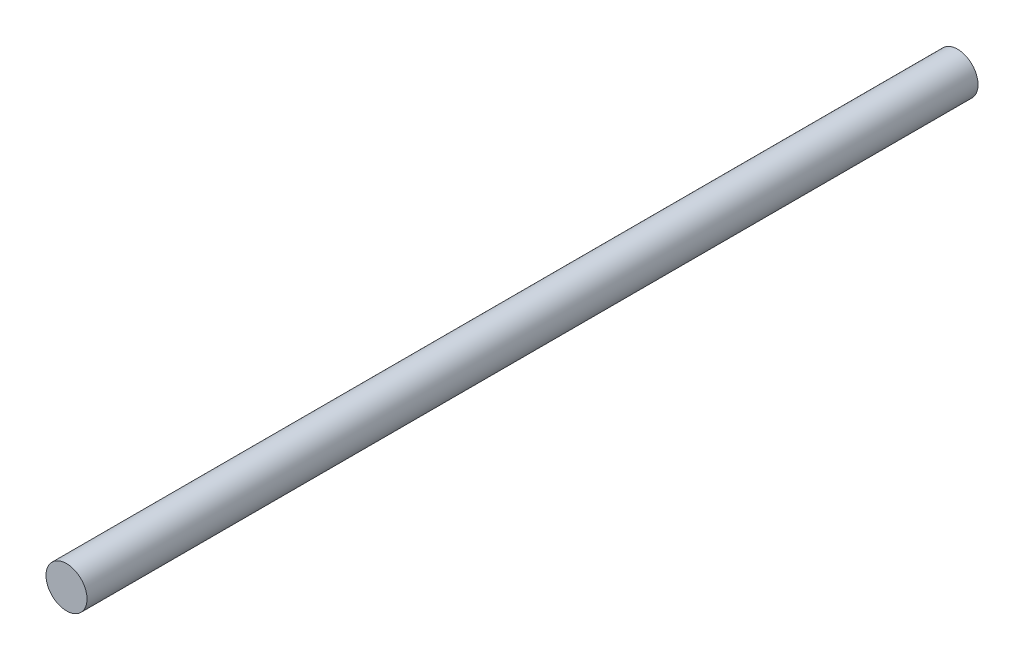
ISO-10303-21;
HEADER;
FILE_DESCRIPTION(('STEP AP214'),'2;1');
FILE_NAME('part.step','',(''),(''),'','','');
FILE_SCHEMA(('AUTOMOTIVE_DESIGN { 1 0 10303 214 1 1 1 1 }'));
ENDSEC;
DATA;
#1=APPLICATION_CONTEXT('core data for automotive mechanical design processes');
#2=APPLICATION_PROTOCOL_DEFINITION('international standard','automotive_design',2000,#1);
#3=PRODUCT_CONTEXT('',#1,'mechanical');
#4=PRODUCT('Part','Part','',(#3));
#5=PRODUCT_RELATED_PRODUCT_CATEGORY('part','',(#4));
#6=PRODUCT_DEFINITION_FORMATION('','',#4);
#7=PRODUCT_DEFINITION_CONTEXT('part definition',#1,'design');
#8=PRODUCT_DEFINITION('design','',#6,#7);
#9=PRODUCT_DEFINITION_SHAPE('','',#8);
#10=(LENGTH_UNIT() NAMED_UNIT(*) SI_UNIT(.MILLI.,.METRE.));
#11=(NAMED_UNIT(*) PLANE_ANGLE_UNIT() SI_UNIT($,.RADIAN.));
#12=(NAMED_UNIT(*) SI_UNIT($,.STERADIAN.) SOLID_ANGLE_UNIT());
#13=UNCERTAINTY_MEASURE_WITH_UNIT(LENGTH_MEASURE(1.E-05),#10,'distance_accuracy_value','');
#14=(GEOMETRIC_REPRESENTATION_CONTEXT(3) GLOBAL_UNCERTAINTY_ASSIGNED_CONTEXT((#13)) GLOBAL_UNIT_ASSIGNED_CONTEXT((#10,
#11,#12)) REPRESENTATION_CONTEXT('',''));
#15=CARTESIAN_POINT('',(0.,0.,0.));
#16=DIRECTION('',(0.,0.,1.));
#17=DIRECTION('',(1.,0.,0.));
#18=AXIS2_PLACEMENT_3D('',#15,#16,#17);
#19=CARTESIAN_POINT('',(0.,0.,173.7));
#20=DIRECTION('',(0.,0.,-1.));
#21=DIRECTION('',(-1.,0.,0.));
#22=AXIS2_PLACEMENT_3D('',#19,#20,#21);
#23=CYLINDRICAL_SURFACE('',#22,4.);
#24=CARTESIAN_POINT('',(0.,0.,173.7));
#25=DIRECTION('',(0.,0.,1.));
#26=DIRECTION('',(1.,0.,0.));
#27=AXIS2_PLACEMENT_3D('',#24,#25,#26);
#28=CIRCLE('',#27,4.);
#29=CARTESIAN_POINT('',(-4.,0.,173.7));
#30=VERTEX_POINT('',#29);
#31=EDGE_CURVE('E10',#30,#30,#28,.T.);
#32=CARTESIAN_POINT('',(0.,0.,0.));
#33=DIRECTION('',(0.,0.,1.));
#34=DIRECTION('',(1.,0.,0.));
#35=AXIS2_PLACEMENT_3D('',#32,#33,#34);
#36=CIRCLE('',#35,4.);
#37=CARTESIAN_POINT('',(-4.,0.,0.));
#38=VERTEX_POINT('',#37);
#39=EDGE_CURVE('E40',#38,#38,#36,.T.);
#40=CARTESIAN_POINT('',(-4.,0.,173.7));
#41=CARTESIAN_POINT('',(-4.,0.,171.890625));
#42=CARTESIAN_POINT('',(-4.,0.,170.08125));
#43=CARTESIAN_POINT('',(-4.,0.,166.4625));
#44=CARTESIAN_POINT('',(-4.,0.,164.653125));
#45=CARTESIAN_POINT('',(-4.,0.,161.034375));
#46=CARTESIAN_POINT('',(-4.,0.,159.225));
#47=CARTESIAN_POINT('',(-4.,0.,155.60625));
#48=CARTESIAN_POINT('',(-4.,0.,153.796875));
#49=CARTESIAN_POINT('',(-4.,0.,150.178125));
#50=CARTESIAN_POINT('',(-4.,0.,148.36875));
#51=CARTESIAN_POINT('',(-4.,0.,144.75));
#52=CARTESIAN_POINT('',(-4.,0.,142.940625));
#53=CARTESIAN_POINT('',(-4.,0.,139.321875));
#54=CARTESIAN_POINT('',(-4.,0.,137.5125));
#55=CARTESIAN_POINT('',(-4.,0.,133.89375));
#56=CARTESIAN_POINT('',(-4.,0.,132.084375));
#57=CARTESIAN_POINT('',(-4.,0.,128.465625));
#58=CARTESIAN_POINT('',(-4.,0.,126.65625));
#59=CARTESIAN_POINT('',(-4.,0.,123.0375));
#60=CARTESIAN_POINT('',(-4.,0.,121.228125));
#61=CARTESIAN_POINT('',(-4.,0.,117.609375));
#62=CARTESIAN_POINT('',(-4.,0.,115.8));
#63=CARTESIAN_POINT('',(-4.,0.,112.18125));
#64=CARTESIAN_POINT('',(-4.,0.,110.371875));
#65=CARTESIAN_POINT('',(-4.,0.,106.753125));
#66=CARTESIAN_POINT('',(-4.,0.,104.94375));
#67=CARTESIAN_POINT('',(-4.,0.,101.325));
#68=CARTESIAN_POINT('',(-4.,0.,99.515625));
#69=CARTESIAN_POINT('',(-4.,0.,95.896875));
#70=CARTESIAN_POINT('',(-4.,0.,94.0875));
#71=CARTESIAN_POINT('',(-4.,0.,90.46875));
#72=CARTESIAN_POINT('',(-4.,0.,88.659375));
#73=CARTESIAN_POINT('',(-4.,0.,85.040625));
#74=CARTESIAN_POINT('',(-4.,0.,83.23125));
#75=CARTESIAN_POINT('',(-4.,0.,79.6125));
#76=CARTESIAN_POINT('',(-4.,0.,77.803125));
#77=CARTESIAN_POINT('',(-4.,0.,74.184375));
#78=CARTESIAN_POINT('',(-4.,0.,72.375));
#79=CARTESIAN_POINT('',(-4.,0.,68.75625));
#80=CARTESIAN_POINT('',(-4.,0.,66.946875));
#81=CARTESIAN_POINT('',(-4.,0.,63.328125));
#82=CARTESIAN_POINT('',(-4.,0.,61.51875));
#83=CARTESIAN_POINT('',(-4.,0.,57.9));
#84=CARTESIAN_POINT('',(-4.,0.,56.090625));
#85=CARTESIAN_POINT('',(-4.,0.,52.471875));
#86=CARTESIAN_POINT('',(-4.,0.,50.6625));
#87=CARTESIAN_POINT('',(-4.,0.,47.04375));
#88=CARTESIAN_POINT('',(-4.,0.,45.234375));
#89=CARTESIAN_POINT('',(-4.,0.,41.615625));
#90=CARTESIAN_POINT('',(-4.,0.,39.80625));
#91=CARTESIAN_POINT('',(-4.,0.,36.1875));
#92=CARTESIAN_POINT('',(-4.,0.,34.378125));
#93=CARTESIAN_POINT('',(-4.,0.,30.759375));
#94=CARTESIAN_POINT('',(-4.,0.,28.95));
#95=CARTESIAN_POINT('',(-4.,0.,25.33125));
#96=CARTESIAN_POINT('',(-4.,0.,23.521875));
#97=CARTESIAN_POINT('',(-4.,0.,19.903125));
#98=CARTESIAN_POINT('',(-4.,0.,18.09375));
#99=CARTESIAN_POINT('',(-4.,0.,14.475));
#100=CARTESIAN_POINT('',(-4.,0.,12.665625));
#101=CARTESIAN_POINT('',(-4.,0.,9.04687500000001));
#102=CARTESIAN_POINT('',(-4.,0.,7.23750000000001));
#103=CARTESIAN_POINT('',(-4.,0.,3.61875));
#104=CARTESIAN_POINT('',(-4.,0.,1.809375));
#105=CARTESIAN_POINT('',(-4.,0.,0.));
#106=B_SPLINE_CURVE_WITH_KNOTS('',3,(#40,#41,#42,#43,#44,#45,#46,#47,#48,#49,#50,#51,#52,#53,
#54,#55,#56,#57,#58,#59,#60,#61,#62,#63,#64,#65,#66,#67,#68,#69,#70,#71,#72,#73,#74,#75,#76,#77,
#78,#79,#80,#81,#82,#83,#84,#85,#86,#87,#88,#89,#90,#91,#92,#93,#94,#95,#96,#97,#98,#99,#100,
#101,#102,#103,#104,#105),.UNSPECIFIED.,.F.,.F.,(4,2,2,2,2,2,2,2,2,2,2,2,2,2,2,2,2,2,2,2,2,2,2,
2,2,2,2,2,2,2,2,2,4),(0.,5.42812499999998,10.85625,16.284375,21.7125,27.140625,32.56875,
37.996875,43.425,48.853125,54.28125,59.709375,65.1375,70.565625,75.99375,81.421875,86.85,
92.278125,97.70625,103.134375,108.5625,113.990625,119.41875,124.846875,130.275,135.703125,
141.13125,146.559375,151.9875,157.415625,162.84375,168.271875,173.7),.UNSPECIFIED.);
#107=EDGE_CURVE('BSEAM37',#30,#38,#106,.T.);
#108=ORIENTED_EDGE('',*,*,#31,.F.);
#109=ORIENTED_EDGE('',*,*,#39,.T.);
#110=ORIENTED_EDGE('',*,*,#107,.T.);
#111=ORIENTED_EDGE('',*,*,#107,.F.);
#112=EDGE_LOOP('',(#108,#110,#109,#111));
#113=FACE_BOUND('',#112,.T.);
#114=ADVANCED_FACE('F37',(#113),#23,.T.);
#115=CARTESIAN_POINT('',(0.,0.,173.7));
#116=DIRECTION('',(0.,0.,1.));
#117=DIRECTION('',(1.,0.,0.));
#118=AXIS2_PLACEMENT_3D('',#115,#116,#117);
#119=PLANE('',#118);
#120=ORIENTED_EDGE('',*,*,#31,.T.);
#121=EDGE_LOOP('',(#120));
#122=FACE_BOUND('',#121,.T.);
#123=ADVANCED_FACE('F54',(#122),#119,.T.);
#124=CARTESIAN_POINT('',(0.,0.,0.));
#125=DIRECTION('',(0.,0.,1.));
#126=DIRECTION('',(1.,0.,0.));
#127=AXIS2_PLACEMENT_3D('',#124,#125,#126);
#128=PLANE('',#127);
#129=ORIENTED_EDGE('',*,*,#39,.F.);
#130=EDGE_LOOP('',(#129));
#131=FACE_BOUND('',#130,.T.);
#132=ADVANCED_FACE('F52',(#131),#128,.F.);
#133=CLOSED_SHELL('',(#114,#123,#132));
#134=MANIFOLD_SOLID_BREP('B2',#133);
#135=ADVANCED_BREP_SHAPE_REPRESENTATION('',(#18,#134),#14);
#136=SHAPE_DEFINITION_REPRESENTATION(#9,#135);
ENDSEC;
END-ISO-10303-21;
